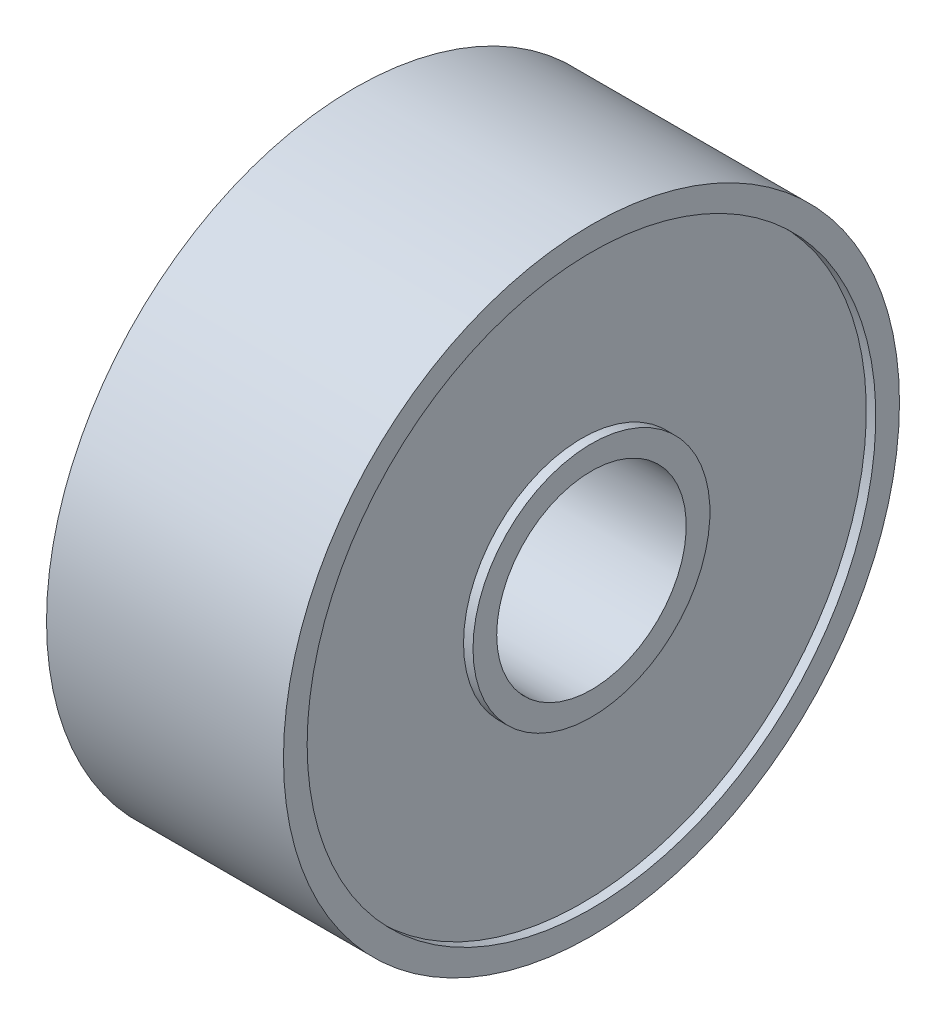
ISO-10303-21;
HEADER;
FILE_DESCRIPTION(('STEP AP214'),'2;1');
FILE_NAME('part.step','',(''),(''),'','','');
FILE_SCHEMA(('AUTOMOTIVE_DESIGN { 1 0 10303 214 1 1 1 1 }'));
ENDSEC;
DATA;
#1=APPLICATION_CONTEXT('core data for automotive mechanical design processes');
#2=APPLICATION_PROTOCOL_DEFINITION('international standard','automotive_design',2000,#1);
#3=PRODUCT_CONTEXT('',#1,'mechanical');
#4=PRODUCT('Part','Part','',(#3));
#5=PRODUCT_RELATED_PRODUCT_CATEGORY('part','',(#4));
#6=PRODUCT_DEFINITION_FORMATION('','',#4);
#7=PRODUCT_DEFINITION_CONTEXT('part definition',#1,'design');
#8=PRODUCT_DEFINITION('design','',#6,#7);
#9=PRODUCT_DEFINITION_SHAPE('','',#8);
#10=(LENGTH_UNIT() NAMED_UNIT(*) SI_UNIT(.MILLI.,.METRE.));
#11=(NAMED_UNIT(*) PLANE_ANGLE_UNIT() SI_UNIT($,.RADIAN.));
#12=(NAMED_UNIT(*) SI_UNIT($,.STERADIAN.) SOLID_ANGLE_UNIT());
#13=UNCERTAINTY_MEASURE_WITH_UNIT(LENGTH_MEASURE(1.E-05),#10,'distance_accuracy_value','');
#14=(GEOMETRIC_REPRESENTATION_CONTEXT(3) GLOBAL_UNCERTAINTY_ASSIGNED_CONTEXT((#13)) GLOBAL_UNIT_ASSIGNED_CONTEXT((#10,
#11,#12)) REPRESENTATION_CONTEXT('',''));
#15=CARTESIAN_POINT('',(0.,0.,0.));
#16=DIRECTION('',(0.,0.,1.));
#17=DIRECTION('',(1.,0.,0.));
#18=AXIS2_PLACEMENT_3D('',#15,#16,#17);
#19=CARTESIAN_POINT('',(-2.5,2.5,0.));
#20=DIRECTION('',(1.,0.,0.));
#21=DIRECTION('',(0.,0.,-1.));
#22=AXIS2_PLACEMENT_3D('',#19,#20,#21);
#23=PLANE('',#22);
#24=CARTESIAN_POINT('',(-2.5,0.,0.));
#25=DIRECTION('',(-1.,0.,0.));
#26=DIRECTION('',(0.,0.,1.));
#27=AXIS2_PLACEMENT_3D('',#24,#25,#26);
#28=CIRCLE('',#27,2.);
#29=CARTESIAN_POINT('',(-2.5,0.,2.));
#30=VERTEX_POINT('',#29);
#31=EDGE_CURVE('E10',#30,#30,#28,.T.);
#32=ORIENTED_EDGE('',*,*,#31,.F.);
#33=EDGE_LOOP('',(#32));
#34=FACE_BOUND('',#33,.T.);
#35=CARTESIAN_POINT('',(-2.5,0.,0.));
#36=DIRECTION('',(-1.,0.,0.));
#37=DIRECTION('',(0.,0.,1.));
#38=AXIS2_PLACEMENT_3D('',#35,#36,#37);
#39=CIRCLE('',#38,2.5);
#40=CARTESIAN_POINT('',(-2.5,0.,2.5));
#41=VERTEX_POINT('',#40);
#42=EDGE_CURVE('E72',#41,#41,#39,.T.);
#43=ORIENTED_EDGE('',*,*,#42,.T.);
#44=EDGE_LOOP('',(#43));
#45=FACE_BOUND('',#44,.T.);
#46=ADVANCED_FACE('F32',(#34,#45),#23,.F.);
#47=CARTESIAN_POINT('',(-2.5,0.,0.));
#48=DIRECTION('',(-1.,0.,0.));
#49=DIRECTION('',(0.,0.,1.));
#50=AXIS2_PLACEMENT_3D('',#47,#48,#49);
#51=CYLINDRICAL_SURFACE('',#50,2.);
#52=CARTESIAN_POINT('',(2.5,0.,0.));
#53=DIRECTION('',(-1.,0.,0.));
#54=DIRECTION('',(0.,0.,1.));
#55=AXIS2_PLACEMENT_3D('',#52,#53,#54);
#56=CIRCLE('',#55,2.);
#57=CARTESIAN_POINT('',(2.5,0.,2.));
#58=VERTEX_POINT('',#57);
#59=EDGE_CURVE('E38',#58,#58,#56,.T.);
#60=ORIENTED_EDGE('',*,*,#59,.F.);
#61=EDGE_LOOP('',(#60));
#62=FACE_BOUND('',#61,.T.);
#63=ORIENTED_EDGE('',*,*,#31,.T.);
#64=EDGE_LOOP('',(#63));
#65=FACE_BOUND('',#64,.T.);
#66=ADVANCED_FACE('F133',(#62,#65),#51,.F.);
#67=CARTESIAN_POINT('',(2.5,2.5,0.));
#68=DIRECTION('',(-1.,0.,0.));
#69=DIRECTION('',(0.,0.,1.));
#70=AXIS2_PLACEMENT_3D('',#67,#68,#69);
#71=PLANE('',#70);
#72=CARTESIAN_POINT('',(2.5,0.,0.));
#73=DIRECTION('',(-1.,0.,0.));
#74=DIRECTION('',(0.,0.,1.));
#75=AXIS2_PLACEMENT_3D('',#72,#73,#74);
#76=CIRCLE('',#75,2.5);
#77=CARTESIAN_POINT('',(2.5,0.,2.5));
#78=VERTEX_POINT('',#77);
#79=EDGE_CURVE('E42',#78,#78,#76,.T.);
#80=ORIENTED_EDGE('',*,*,#79,.F.);
#81=EDGE_LOOP('',(#80));
#82=FACE_BOUND('',#81,.T.);
#83=ORIENTED_EDGE('',*,*,#59,.T.);
#84=EDGE_LOOP('',(#83));
#85=FACE_BOUND('',#84,.T.);
#86=ADVANCED_FACE('F128',(#82,#85),#71,.F.);
#87=CARTESIAN_POINT('',(-2.5,0.,0.));
#88=DIRECTION('',(-1.,0.,0.));
#89=DIRECTION('',(0.,0.,1.));
#90=AXIS2_PLACEMENT_3D('',#87,#88,#89);
#91=CYLINDRICAL_SURFACE('',#90,2.5);
#92=CARTESIAN_POINT('',(2.3,0.,0.));
#93=DIRECTION('',(-1.,0.,0.));
#94=DIRECTION('',(0.,0.,1.));
#95=AXIS2_PLACEMENT_3D('',#92,#93,#94);
#96=CIRCLE('',#95,2.5);
#97=CARTESIAN_POINT('',(2.3,0.,2.5));
#98=VERTEX_POINT('',#97);
#99=EDGE_CURVE('E46',#98,#98,#96,.T.);
#100=ORIENTED_EDGE('',*,*,#99,.F.);
#101=EDGE_LOOP('',(#100));
#102=FACE_BOUND('',#101,.T.);
#103=ORIENTED_EDGE('',*,*,#79,.T.);
#104=EDGE_LOOP('',(#103));
#105=FACE_BOUND('',#104,.T.);
#106=ADVANCED_FACE('F122',(#102,#105),#91,.T.);
#107=CARTESIAN_POINT('',(2.3,6.,0.));
#108=DIRECTION('',(-1.,0.,0.));
#109=DIRECTION('',(0.,0.,1.));
#110=AXIS2_PLACEMENT_3D('',#107,#108,#109);
#111=PLANE('',#110);
#112=CARTESIAN_POINT('',(2.3,0.,0.));
#113=DIRECTION('',(-1.,0.,0.));
#114=DIRECTION('',(0.,0.,1.));
#115=AXIS2_PLACEMENT_3D('',#112,#113,#114);
#116=CIRCLE('',#115,6.);
#117=CARTESIAN_POINT('',(2.3,0.,6.));
#118=VERTEX_POINT('',#117);
#119=EDGE_CURVE('E51',#118,#118,#116,.T.);
#120=ORIENTED_EDGE('',*,*,#119,.F.);
#121=EDGE_LOOP('',(#120));
#122=FACE_BOUND('',#121,.T.);
#123=ORIENTED_EDGE('',*,*,#99,.T.);
#124=EDGE_LOOP('',(#123));
#125=FACE_BOUND('',#124,.T.);
#126=ADVANCED_FACE('F116',(#122,#125),#111,.F.);
#127=CARTESIAN_POINT('',(-2.5,0.,0.));
#128=DIRECTION('',(-1.,0.,0.));
#129=DIRECTION('',(0.,0.,1.));
#130=AXIS2_PLACEMENT_3D('',#127,#128,#129);
#131=CYLINDRICAL_SURFACE('',#130,6.);
#132=CARTESIAN_POINT('',(2.5,0.,0.));
#133=DIRECTION('',(-1.,0.,0.));
#134=DIRECTION('',(0.,0.,1.));
#135=AXIS2_PLACEMENT_3D('',#132,#133,#134);
#136=CIRCLE('',#135,6.);
#137=CARTESIAN_POINT('',(2.5,0.,6.));
#138=VERTEX_POINT('',#137);
#139=EDGE_CURVE('E54',#138,#138,#136,.T.);
#140=ORIENTED_EDGE('',*,*,#139,.F.);
#141=EDGE_LOOP('',(#140));
#142=FACE_BOUND('',#141,.T.);
#143=ORIENTED_EDGE('',*,*,#119,.T.);
#144=EDGE_LOOP('',(#143));
#145=FACE_BOUND('',#144,.T.);
#146=ADVANCED_FACE('F110',(#142,#145),#131,.F.);
#147=CARTESIAN_POINT('',(2.5,6.5,0.));
#148=DIRECTION('',(-1.,0.,0.));
#149=DIRECTION('',(0.,0.,1.));
#150=AXIS2_PLACEMENT_3D('',#147,#148,#149);
#151=PLANE('',#150);
#152=CARTESIAN_POINT('',(2.5,0.,0.));
#153=DIRECTION('',(-1.,0.,0.));
#154=DIRECTION('',(0.,0.,1.));
#155=AXIS2_PLACEMENT_3D('',#152,#153,#154);
#156=CIRCLE('',#155,6.5);
#157=CARTESIAN_POINT('',(2.5,0.,6.5));
#158=VERTEX_POINT('',#157);
#159=EDGE_CURVE('E57',#158,#158,#156,.T.);
#160=ORIENTED_EDGE('',*,*,#159,.F.);
#161=EDGE_LOOP('',(#160));
#162=FACE_BOUND('',#161,.T.);
#163=ORIENTED_EDGE('',*,*,#139,.T.);
#164=EDGE_LOOP('',(#163));
#165=FACE_BOUND('',#164,.T.);
#166=ADVANCED_FACE('F104',(#162,#165),#151,.F.);
#167=CARTESIAN_POINT('',(-2.5,0.,0.));
#168=DIRECTION('',(-1.,0.,0.));
#169=DIRECTION('',(0.,0.,1.));
#170=AXIS2_PLACEMENT_3D('',#167,#168,#169);
#171=CYLINDRICAL_SURFACE('',#170,6.5);
#172=CARTESIAN_POINT('',(-2.5,0.,0.));
#173=DIRECTION('',(-1.,0.,0.));
#174=DIRECTION('',(0.,0.,1.));
#175=AXIS2_PLACEMENT_3D('',#172,#173,#174);
#176=CIRCLE('',#175,6.5);
#177=CARTESIAN_POINT('',(-2.5,0.,6.5));
#178=VERTEX_POINT('',#177);
#179=EDGE_CURVE('E60',#178,#178,#176,.T.);
#180=ORIENTED_EDGE('',*,*,#179,.F.);
#181=EDGE_LOOP('',(#180));
#182=FACE_BOUND('',#181,.T.);
#183=ORIENTED_EDGE('',*,*,#159,.T.);
#184=EDGE_LOOP('',(#183));
#185=FACE_BOUND('',#184,.T.);
#186=ADVANCED_FACE('F98',(#182,#185),#171,.T.);
#187=CARTESIAN_POINT('',(-2.5,6.5,0.));
#188=DIRECTION('',(1.,0.,0.));
#189=DIRECTION('',(0.,0.,-1.));
#190=AXIS2_PLACEMENT_3D('',#187,#188,#189);
#191=PLANE('',#190);
#192=CARTESIAN_POINT('',(-2.5,0.,0.));
#193=DIRECTION('',(-1.,0.,0.));
#194=DIRECTION('',(0.,0.,1.));
#195=AXIS2_PLACEMENT_3D('',#192,#193,#194);
#196=CIRCLE('',#195,6.);
#197=CARTESIAN_POINT('',(-2.5,0.,6.));
#198=VERTEX_POINT('',#197);
#199=EDGE_CURVE('E63',#198,#198,#196,.T.);
#200=ORIENTED_EDGE('',*,*,#199,.F.);
#201=EDGE_LOOP('',(#200));
#202=FACE_BOUND('',#201,.T.);
#203=ORIENTED_EDGE('',*,*,#179,.T.);
#204=EDGE_LOOP('',(#203));
#205=FACE_BOUND('',#204,.T.);
#206=ADVANCED_FACE('F92',(#202,#205),#191,.F.);
#207=CARTESIAN_POINT('',(-2.5,0.,0.));
#208=DIRECTION('',(-1.,0.,0.));
#209=DIRECTION('',(0.,0.,1.));
#210=AXIS2_PLACEMENT_3D('',#207,#208,#209);
#211=CYLINDRICAL_SURFACE('',#210,6.);
#212=CARTESIAN_POINT('',(-2.3,0.,0.));
#213=DIRECTION('',(-1.,0.,0.));
#214=DIRECTION('',(0.,0.,1.));
#215=AXIS2_PLACEMENT_3D('',#212,#213,#214);
#216=CIRCLE('',#215,6.);
#217=CARTESIAN_POINT('',(-2.3,0.,6.));
#218=VERTEX_POINT('',#217);
#219=EDGE_CURVE('E66',#218,#218,#216,.T.);
#220=ORIENTED_EDGE('',*,*,#219,.F.);
#221=EDGE_LOOP('',(#220));
#222=FACE_BOUND('',#221,.T.);
#223=ORIENTED_EDGE('',*,*,#199,.T.);
#224=EDGE_LOOP('',(#223));
#225=FACE_BOUND('',#224,.T.);
#226=ADVANCED_FACE('F86',(#222,#225),#211,.F.);
#227=CARTESIAN_POINT('',(-2.3,6.,0.));
#228=DIRECTION('',(1.,0.,0.));
#229=DIRECTION('',(0.,0.,-1.));
#230=AXIS2_PLACEMENT_3D('',#227,#228,#229);
#231=PLANE('',#230);
#232=CARTESIAN_POINT('',(-2.3,0.,0.));
#233=DIRECTION('',(-1.,0.,0.));
#234=DIRECTION('',(0.,0.,1.));
#235=AXIS2_PLACEMENT_3D('',#232,#233,#234);
#236=CIRCLE('',#235,2.5);
#237=CARTESIAN_POINT('',(-2.3,0.,2.5));
#238=VERTEX_POINT('',#237);
#239=EDGE_CURVE('E69',#238,#238,#236,.T.);
#240=ORIENTED_EDGE('',*,*,#239,.F.);
#241=EDGE_LOOP('',(#240));
#242=FACE_BOUND('',#241,.T.);
#243=ORIENTED_EDGE('',*,*,#219,.T.);
#244=EDGE_LOOP('',(#243));
#245=FACE_BOUND('',#244,.T.);
#246=ADVANCED_FACE('F80',(#242,#245),#231,.F.);
#247=CARTESIAN_POINT('',(-2.5,0.,0.));
#248=DIRECTION('',(-1.,0.,0.));
#249=DIRECTION('',(0.,0.,1.));
#250=AXIS2_PLACEMENT_3D('',#247,#248,#249);
#251=CYLINDRICAL_SURFACE('',#250,2.5);
#252=ORIENTED_EDGE('',*,*,#42,.F.);
#253=EDGE_LOOP('',(#252));
#254=FACE_BOUND('',#253,.T.);
#255=ORIENTED_EDGE('',*,*,#239,.T.);
#256=EDGE_LOOP('',(#255));
#257=FACE_BOUND('',#256,.T.);
#258=ADVANCED_FACE('F77',(#254,#257),#251,.T.);
#259=CLOSED_SHELL('',(#46,#66,#86,#106,#126,#146,#166,#186,#206,#226,#246,#258));
#260=MANIFOLD_SOLID_BREP('B2',#259);
#261=ADVANCED_BREP_SHAPE_REPRESENTATION('',(#18,#260),#14);
#262=SHAPE_DEFINITION_REPRESENTATION(#9,#261);
ENDSEC;
END-ISO-10303-21;
